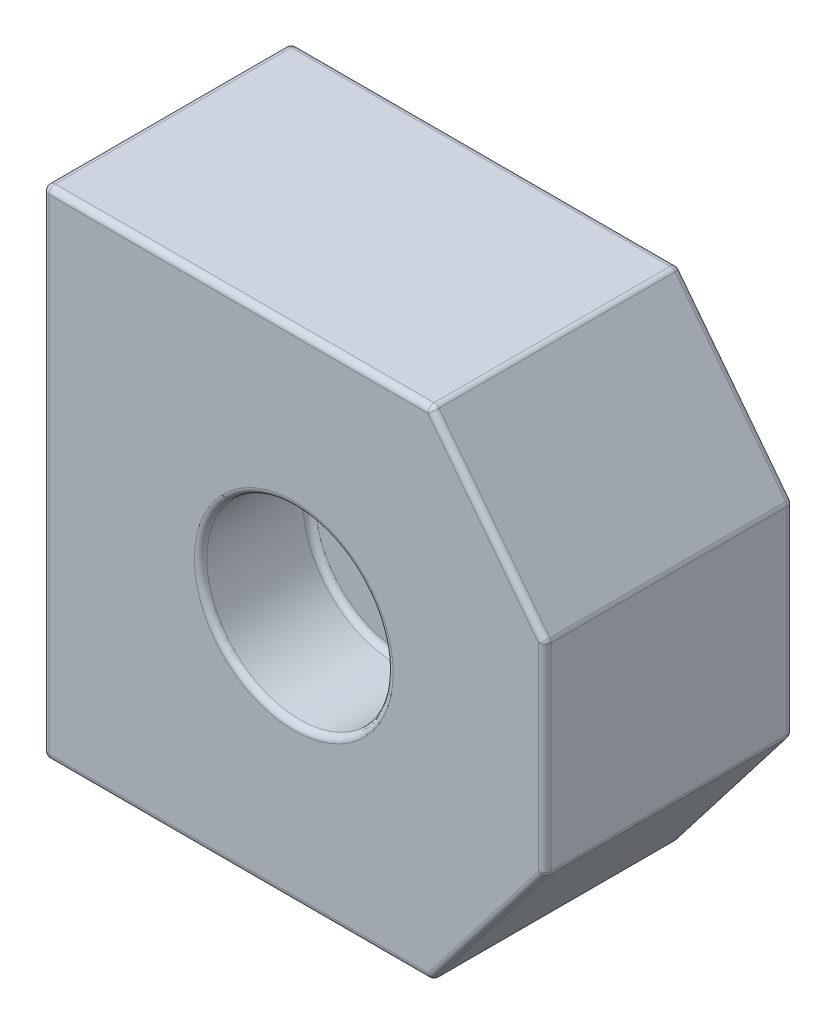
ISO-10303-21;
HEADER;
FILE_DESCRIPTION(('STEP AP214'),'2;1');
FILE_NAME('part.step','',(''),(''),'','','');
FILE_SCHEMA(('AUTOMOTIVE_DESIGN { 1 0 10303 214 1 1 1 1 }'));
ENDSEC;
DATA;
#1=APPLICATION_CONTEXT('core data for automotive mechanical design processes');
#2=APPLICATION_PROTOCOL_DEFINITION('international standard','automotive_design',2000,#1);
#3=PRODUCT_CONTEXT('',#1,'mechanical');
#4=PRODUCT('Part','Part','',(#3));
#5=PRODUCT_RELATED_PRODUCT_CATEGORY('part','',(#4));
#6=PRODUCT_DEFINITION_FORMATION('','',#4);
#7=PRODUCT_DEFINITION_CONTEXT('part definition',#1,'design');
#8=PRODUCT_DEFINITION('design','',#6,#7);
#9=PRODUCT_DEFINITION_SHAPE('','',#8);
#10=(LENGTH_UNIT() NAMED_UNIT(*) SI_UNIT(.MILLI.,.METRE.));
#11=(NAMED_UNIT(*) PLANE_ANGLE_UNIT() SI_UNIT($,.RADIAN.));
#12=(NAMED_UNIT(*) SI_UNIT($,.STERADIAN.) SOLID_ANGLE_UNIT());
#13=UNCERTAINTY_MEASURE_WITH_UNIT(LENGTH_MEASURE(1.E-05),#10,'distance_accuracy_value','');
#14=(GEOMETRIC_REPRESENTATION_CONTEXT(3) GLOBAL_UNCERTAINTY_ASSIGNED_CONTEXT((#13)) GLOBAL_UNIT_ASSIGNED_CONTEXT((#10,
#11,#12)) REPRESENTATION_CONTEXT('',''));
#15=CARTESIAN_POINT('',(0.,0.,0.));
#16=DIRECTION('',(0.,0.,1.));
#17=DIRECTION('',(1.,0.,0.));
#18=AXIS2_PLACEMENT_3D('',#15,#16,#17);
#19=CARTESIAN_POINT('',(25.,0.,16.));
#20=DIRECTION('',(0.,-1.,0.));
#21=DIRECTION('',(1.,0.,0.));
#22=AXIS2_PLACEMENT_3D('',#19,#20,#21);
#23=PLANE('',#22);
#24=DIRECTION('',(-1.,0.,0.));
#25=VECTOR('',#24,1.);
#26=CARTESIAN_POINT('',(25.,0.,15.6));
#27=LINE('',#26,#25);
#28=CARTESIAN_POINT('',(0.4,0.,15.6));
#29=VERTEX_POINT('',#28);
#30=CARTESIAN_POINT('',(24.803429016813,0.,15.6));
#31=VERTEX_POINT('',#30);
#32=EDGE_CURVE('E48',#29,#31,#27,.F.);
#33=ORIENTED_EDGE('',*,*,#32,.T.);
#34=DIRECTION('',(0.,0.,-1.));
#35=VECTOR('',#34,1.);
#36=CARTESIAN_POINT('',(24.803429016813,0.,16.));
#37=LINE('',#36,#35);
#38=CARTESIAN_POINT('',(24.803429016813,0.,0.399999999999999));
#39=VERTEX_POINT('',#38);
#40=EDGE_CURVE('E11',#31,#39,#37,.T.);
#41=ORIENTED_EDGE('',*,*,#40,.T.);
#42=DIRECTION('',(-1.,0.,0.));
#43=VECTOR('',#42,1.);
#44=CARTESIAN_POINT('',(25.,0.,0.399999999999999));
#45=LINE('',#44,#43);
#46=CARTESIAN_POINT('',(0.4,0.,0.399999999999999));
#47=VERTEX_POINT('',#46);
#48=EDGE_CURVE('E270',#39,#47,#45,.T.);
#49=ORIENTED_EDGE('',*,*,#48,.T.);
#50=DIRECTION('',(0.,0.,-1.));
#51=VECTOR('',#50,1.);
#52=CARTESIAN_POINT('',(0.400000000000001,0.,16.));
#53=LINE('',#52,#51);
#54=EDGE_CURVE('E59',#47,#29,#53,.F.);
#55=ORIENTED_EDGE('',*,*,#54,.T.);
#56=EDGE_LOOP('',(#33,#41,#49,#55));
#57=FACE_BOUND('',#56,.T.);
#58=ADVANCED_FACE('F39',(#57),#23,.F.);
#59=CARTESIAN_POINT('',(0.,0.,16.));
#60=DIRECTION('',(1.,0.,0.));
#61=DIRECTION('',(0.,1.,0.));
#62=AXIS2_PLACEMENT_3D('',#59,#60,#61);
#63=PLANE('',#62);
#64=DIRECTION('',(0.,-1.,0.));
#65=VECTOR('',#64,1.);
#66=CARTESIAN_POINT('',(0.,0.,0.399999999999999));
#67=LINE('',#66,#65);
#68=CARTESIAN_POINT('',(0.,-0.4,0.399999999999999));
#69=VERTEX_POINT('',#68);
#70=CARTESIAN_POINT('',(0.,-31.6,0.399999999999999));
#71=VERTEX_POINT('',#70);
#72=EDGE_CURVE('E249',#69,#71,#67,.T.);
#73=ORIENTED_EDGE('',*,*,#72,.T.);
#74=DIRECTION('',(0.,0.,-1.));
#75=VECTOR('',#74,1.);
#76=CARTESIAN_POINT('',(0.,-31.6,16.));
#77=LINE('',#76,#75);
#78=CARTESIAN_POINT('',(0.,-31.6,15.6));
#79=VERTEX_POINT('',#78);
#80=EDGE_CURVE('E251',#71,#79,#77,.F.);
#81=ORIENTED_EDGE('',*,*,#80,.T.);
#82=DIRECTION('',(0.,-1.,0.));
#83=VECTOR('',#82,1.);
#84=CARTESIAN_POINT('',(0.,0.,15.6));
#85=LINE('',#84,#83);
#86=CARTESIAN_POINT('',(0.,-0.4,15.6));
#87=VERTEX_POINT('',#86);
#88=EDGE_CURVE('E247',#79,#87,#85,.F.);
#89=ORIENTED_EDGE('',*,*,#88,.T.);
#90=DIRECTION('',(0.,0.,-1.));
#91=VECTOR('',#90,1.);
#92=CARTESIAN_POINT('',(0.,-0.4,16.));
#93=LINE('',#92,#91);
#94=EDGE_CURVE('E245',#87,#69,#93,.T.);
#95=ORIENTED_EDGE('',*,*,#94,.T.);
#96=EDGE_LOOP('',(#73,#81,#89,#95));
#97=FACE_BOUND('',#96,.T.);
#98=ADVANCED_FACE('F421',(#97),#63,.F.);
#99=CARTESIAN_POINT('',(0.,-32.,16.));
#100=DIRECTION('',(0.,1.,0.));
#101=DIRECTION('',(0.,0.,1.));
#102=AXIS2_PLACEMENT_3D('',#99,#100,#101);
#103=PLANE('',#102);
#104=DIRECTION('',(0.,0.,-1.));
#105=VECTOR('',#104,1.);
#106=CARTESIAN_POINT('',(0.400000000000004,-32.,16.));
#107=LINE('',#106,#105);
#108=CARTESIAN_POINT('',(0.400000000000004,-32.,15.6));
#109=VERTEX_POINT('',#108);
#110=CARTESIAN_POINT('',(0.400000000000004,-32.,0.399999999999999));
#111=VERTEX_POINT('',#110);
#112=EDGE_CURVE('E229',#109,#111,#107,.T.);
#113=ORIENTED_EDGE('',*,*,#112,.T.);
#114=DIRECTION('',(1.,0.,0.));
#115=VECTOR('',#114,1.);
#116=CARTESIAN_POINT('',(0.,-32.,0.399999999999999));
#117=LINE('',#116,#115);
#118=CARTESIAN_POINT('',(24.8034290168129,-32.,0.399999999999999));
#119=VERTEX_POINT('',#118);
#120=EDGE_CURVE('E233',#111,#119,#117,.T.);
#121=ORIENTED_EDGE('',*,*,#120,.T.);
#122=DIRECTION('',(0.,0.,-1.));
#123=VECTOR('',#122,1.);
#124=CARTESIAN_POINT('',(24.8034290168129,-32.,16.));
#125=LINE('',#124,#123);
#126=CARTESIAN_POINT('',(24.8034290168129,-32.,15.6));
#127=VERTEX_POINT('',#126);
#128=EDGE_CURVE('E231',#119,#127,#125,.F.);
#129=ORIENTED_EDGE('',*,*,#128,.T.);
#130=DIRECTION('',(1.,0.,0.));
#131=VECTOR('',#130,1.);
#132=CARTESIAN_POINT('',(0.,-32.,15.6));
#133=LINE('',#132,#131);
#134=EDGE_CURVE('E227',#127,#109,#133,.F.);
#135=ORIENTED_EDGE('',*,*,#134,.T.);
#136=EDGE_LOOP('',(#113,#121,#129,#135));
#137=FACE_BOUND('',#136,.T.);
#138=ADVANCED_FACE('F426',(#137),#103,.F.);
#139=CARTESIAN_POINT('',(25.,-32.,16.));
#140=DIRECTION('',(-0.791666666666667,0.610953262442299,0.));
#141=DIRECTION('',(-0.610953262442299,-0.791666666666667,0.));
#142=AXIS2_PLACEMENT_3D('',#139,#140,#141);
#143=PLANE('',#142);
#144=DIRECTION('',(0.,0.,-1.));
#145=VECTOR('',#144,1.);
#146=CARTESIAN_POINT('',(25.1200956834796,-31.8443813049769,16.));
#147=LINE('',#146,#145);
#148=CARTESIAN_POINT('',(25.1200956834796,-31.8443813049769,15.6));
#149=VERTEX_POINT('',#148);
#150=CARTESIAN_POINT('',(25.1200956834796,-31.8443813049769,0.399999999999999));
#151=VERTEX_POINT('',#150);
#152=EDGE_CURVE('E240',#149,#151,#147,.T.);
#153=ORIENTED_EDGE('',*,*,#152,.T.);
#154=DIRECTION('',(0.610953262442299,0.791666666666667,0.));
#155=VECTOR('',#154,1.);
#156=CARTESIAN_POINT('',(25.,-32.,0.399999999999999));
#157=LINE('',#156,#155);
#158=CARTESIAN_POINT('',(32.2481058159743,-22.6079824370828,0.399999999999999));
#159=VERTEX_POINT('',#158);
#160=EDGE_CURVE('E243',#151,#159,#157,.T.);
#161=ORIENTED_EDGE('',*,*,#160,.T.);
#162=DIRECTION('',(0.,0.,-1.));
#163=VECTOR('',#162,1.);
#164=CARTESIAN_POINT('',(32.2481058159743,-22.6079824370828,16.));
#165=LINE('',#164,#163);
#166=CARTESIAN_POINT('',(32.2481058159743,-22.6079824370828,15.6));
#167=VERTEX_POINT('',#166);
#168=EDGE_CURVE('E238',#159,#167,#165,.F.);
#169=ORIENTED_EDGE('',*,*,#168,.T.);
#170=DIRECTION('',(0.610953262442299,0.791666666666667,0.));
#171=VECTOR('',#170,1.);
#172=CARTESIAN_POINT('',(25.,-32.,15.6));
#173=LINE('',#172,#171);
#174=EDGE_CURVE('E236',#167,#149,#173,.F.);
#175=ORIENTED_EDGE('',*,*,#174,.T.);
#176=EDGE_LOOP('',(#153,#161,#169,#175));
#177=FACE_BOUND('',#176,.T.);
#178=ADVANCED_FACE('F573',(#177),#143,.F.);
#179=CARTESIAN_POINT('',(32.3314391493076,-22.5,16.));
#180=DIRECTION('',(-1.,0.,0.));
#181=DIRECTION('',(0.,0.,1.));
#182=AXIS2_PLACEMENT_3D('',#179,#180,#181);
#183=PLANE('',#182);
#184=DIRECTION('',(0.,1.,0.));
#185=VECTOR('',#184,1.);
#186=CARTESIAN_POINT('',(32.3314391493076,-22.5,0.399999999999999));
#187=LINE('',#186,#185);
#188=CARTESIAN_POINT('',(32.3314391493076,-22.3636011321059,0.399999999999999));
#189=VERTEX_POINT('',#188);
#190=CARTESIAN_POINT('',(32.3314391493076,-9.6363988678941,0.399999999999999));
#191=VERTEX_POINT('',#190);
#192=EDGE_CURVE('E222',#189,#191,#187,.T.);
#193=ORIENTED_EDGE('',*,*,#192,.T.);
#194=DIRECTION('',(0.,0.,-1.));
#195=VECTOR('',#194,1.);
#196=CARTESIAN_POINT('',(32.3314391493076,-9.6363988678941,16.));
#197=LINE('',#196,#195);
#198=CARTESIAN_POINT('',(32.3314391493076,-9.6363988678941,15.6));
#199=VERTEX_POINT('',#198);
#200=EDGE_CURVE('E224',#191,#199,#197,.F.);
#201=ORIENTED_EDGE('',*,*,#200,.T.);
#202=DIRECTION('',(0.,1.,0.));
#203=VECTOR('',#202,1.);
#204=CARTESIAN_POINT('',(32.3314391493076,-22.5,15.6));
#205=LINE('',#204,#203);
#206=CARTESIAN_POINT('',(32.3314391493076,-22.3636011321059,15.6));
#207=VERTEX_POINT('',#206);
#208=EDGE_CURVE('E218',#199,#207,#205,.F.);
#209=ORIENTED_EDGE('',*,*,#208,.T.);
#210=DIRECTION('',(0.,0.,-1.));
#211=VECTOR('',#210,1.);
#212=CARTESIAN_POINT('',(32.3314391493076,-22.3636011321059,16.));
#213=LINE('',#212,#211);
#214=EDGE_CURVE('E220',#207,#189,#213,.T.);
#215=ORIENTED_EDGE('',*,*,#214,.T.);
#216=EDGE_LOOP('',(#193,#201,#209,#215));
#217=FACE_BOUND('',#216,.T.);
#218=ADVANCED_FACE('F570',(#217),#183,.F.);
#219=CARTESIAN_POINT('',(32.3314391493076,-9.5,16.));
#220=DIRECTION('',(-0.791666666666667,-0.610953262442299,0.));
#221=DIRECTION('',(0.610953262442299,-0.791666666666667,0.));
#222=AXIS2_PLACEMENT_3D('',#219,#220,#221);
#223=PLANE('',#222);
#224=DIRECTION('',(0.,0.,-1.));
#225=VECTOR('',#224,1.);
#226=CARTESIAN_POINT('',(32.2481058159743,-9.39201756291718,16.));
#227=LINE('',#226,#225);
#228=CARTESIAN_POINT('',(32.2481058159743,-9.39201756291718,15.6));
#229=VERTEX_POINT('',#228);
#230=CARTESIAN_POINT('',(32.2481058159743,-9.39201756291718,0.399999999999999));
#231=VERTEX_POINT('',#230);
#232=EDGE_CURVE('E198',#229,#231,#227,.T.);
#233=ORIENTED_EDGE('',*,*,#232,.T.);
#234=DIRECTION('',(-0.610953262442299,0.791666666666667,0.));
#235=VECTOR('',#234,1.);
#236=CARTESIAN_POINT('',(32.3314391493076,-9.5,0.399999999999999));
#237=LINE('',#236,#235);
#238=CARTESIAN_POINT('',(25.1200956834796,-0.155618695023082,0.399999999999999));
#239=VERTEX_POINT('',#238);
#240=EDGE_CURVE('E169',#231,#239,#237,.T.);
#241=ORIENTED_EDGE('',*,*,#240,.T.);
#242=DIRECTION('',(0.,0.,-1.));
#243=VECTOR('',#242,1.);
#244=CARTESIAN_POINT('',(25.1200956834796,-0.155618695023084,16.));
#245=LINE('',#244,#243);
#246=CARTESIAN_POINT('',(25.1200956834796,-0.155618695023082,15.6));
#247=VERTEX_POINT('',#246);
#248=EDGE_CURVE('E187',#239,#247,#245,.F.);
#249=ORIENTED_EDGE('',*,*,#248,.T.);
#250=DIRECTION('',(-0.610953262442299,0.791666666666667,0.));
#251=VECTOR('',#250,1.);
#252=CARTESIAN_POINT('',(32.3314391493076,-9.5,15.6));
#253=LINE('',#252,#251);
#254=EDGE_CURVE('E193',#247,#229,#253,.F.);
#255=ORIENTED_EDGE('',*,*,#254,.T.);
#256=EDGE_LOOP('',(#233,#241,#249,#255));
#257=FACE_BOUND('',#256,.T.);
#258=ADVANCED_FACE('F196',(#257),#223,.F.);
#259=CARTESIAN_POINT('',(0.,0.,16.));
#260=DIRECTION('',(0.,0.,1.));
#261=DIRECTION('',(1.,0.,0.));
#262=AXIS2_PLACEMENT_3D('',#259,#260,#261);
#263=PLANE('',#262);
#264=CARTESIAN_POINT('',(16.1657195746538,-16.,16.));
#265=DIRECTION('',(0.,0.,1.));
#266=DIRECTION('',(1.,0.,0.));
#267=AXIS2_PLACEMENT_3D('',#264,#265,#266);
#268=CIRCLE('',#267,6.4);
#269=CARTESIAN_POINT('',(22.5657195746538,-16.,16.));
#270=VERTEX_POINT('',#269);
#271=EDGE_CURVE('E267',#270,#270,#268,.F.);
#272=ORIENTED_EDGE('',*,*,#271,.T.);
#273=EDGE_LOOP('',(#272));
#274=FACE_BOUND('',#273,.T.);
#275=DIRECTION('',(0.,1.,0.));
#276=VECTOR('',#275,1.);
#277=CARTESIAN_POINT('',(31.9314391493076,-9.5,16.));
#278=LINE('',#277,#276);
#279=CARTESIAN_POINT('',(31.9314391493076,-22.3636011321059,16.));
#280=VERTEX_POINT('',#279);
#281=CARTESIAN_POINT('',(31.9314391493076,-9.6363988678941,16.));
#282=VERTEX_POINT('',#281);
#283=EDGE_CURVE('E262',#280,#282,#278,.T.);
#284=ORIENTED_EDGE('',*,*,#283,.T.);
#285=DIRECTION('',(-0.610953262442299,0.791666666666667,0.));
#286=VECTOR('',#285,1.);
#287=CARTESIAN_POINT('',(24.6833333333333,-0.244381304976924,16.));
#288=LINE('',#287,#286);
#289=CARTESIAN_POINT('',(24.803429016813,-0.400000000000002,16.));
#290=VERTEX_POINT('',#289);
#291=EDGE_CURVE('E264',#282,#290,#288,.T.);
#292=ORIENTED_EDGE('',*,*,#291,.T.);
#293=DIRECTION('',(-1.,0.,0.));
#294=VECTOR('',#293,1.);
#295=CARTESIAN_POINT('',(0.,-0.4,16.));
#296=LINE('',#295,#294);
#297=CARTESIAN_POINT('',(0.4,-0.4,16.));
#298=VERTEX_POINT('',#297);
#299=EDGE_CURVE('E254',#290,#298,#296,.T.);
#300=ORIENTED_EDGE('',*,*,#299,.T.);
#301=DIRECTION('',(0.,-1.,0.));
#302=VECTOR('',#301,1.);
#303=CARTESIAN_POINT('',(0.400000000000004,-32.,16.));
#304=LINE('',#303,#302);
#305=CARTESIAN_POINT('',(0.400000000000004,-31.6,16.));
#306=VERTEX_POINT('',#305);
#307=EDGE_CURVE('E256',#298,#306,#304,.T.);
#308=ORIENTED_EDGE('',*,*,#307,.T.);
#309=DIRECTION('',(1.,0.,0.));
#310=VECTOR('',#309,1.);
#311=CARTESIAN_POINT('',(25.,-31.6,16.));
#312=LINE('',#311,#310);
#313=CARTESIAN_POINT('',(24.803429016813,-31.6,16.));
#314=VERTEX_POINT('',#313);
#315=EDGE_CURVE('E258',#306,#314,#312,.T.);
#316=ORIENTED_EDGE('',*,*,#315,.T.);
#317=DIRECTION('',(0.610953262442299,0.791666666666667,0.));
#318=VECTOR('',#317,1.);
#319=CARTESIAN_POINT('',(32.0147724826409,-22.2556186950231,16.));
#320=LINE('',#319,#318);
#321=EDGE_CURVE('E260',#314,#280,#320,.T.);
#322=ORIENTED_EDGE('',*,*,#321,.T.);
#323=EDGE_LOOP('',(#284,#292,#300,#308,#316,#322));
#324=FACE_BOUND('',#323,.T.);
#325=ADVANCED_FACE('F561',(#274,#324),#263,.T.);
#326=CARTESIAN_POINT('',(0.,0.,0.));
#327=DIRECTION('',(0.,0.,1.));
#328=DIRECTION('',(1.,0.,0.));
#329=AXIS2_PLACEMENT_3D('',#326,#327,#328);
#330=PLANE('',#329);
#331=DIRECTION('',(-0.610953262442299,0.791666666666667,0.));
#332=VECTOR('',#331,1.);
#333=CARTESIAN_POINT('',(15.3517361111111,11.8474020141936,0.));
#334=LINE('',#333,#332);
#335=CARTESIAN_POINT('',(24.803429016813,-0.400000000000002,0.));
#336=VERTEX_POINT('',#335);
#337=CARTESIAN_POINT('',(31.9314391493076,-9.6363988678941,0.));
#338=VERTEX_POINT('',#337);
#339=EDGE_CURVE('E171',#336,#338,#334,.F.);
#340=ORIENTED_EDGE('',*,*,#339,.T.);
#341=DIRECTION('',(0.,1.,0.));
#342=VECTOR('',#341,1.);
#343=CARTESIAN_POINT('',(31.9314391493076,0.,0.));
#344=LINE('',#343,#342);
#345=CARTESIAN_POINT('',(31.9314391493076,-22.3636011321059,0.));
#346=VERTEX_POINT('',#345);
#347=EDGE_CURVE('E216',#338,#346,#344,.F.);
#348=ORIENTED_EDGE('',*,*,#347,.T.);
#349=DIRECTION('',(0.610953262442299,0.791666666666667,0.));
#350=VECTOR('',#349,1.);
#351=CARTESIAN_POINT('',(30.8292187596494,-23.791846458638,0.));
#352=LINE('',#351,#350);
#353=CARTESIAN_POINT('',(24.8034290168129,-31.6,0.));
#354=VERTEX_POINT('',#353);
#355=EDGE_CURVE('E214',#346,#354,#352,.F.);
#356=ORIENTED_EDGE('',*,*,#355,.T.);
#357=DIRECTION('',(1.,0.,0.));
#358=VECTOR('',#357,1.);
#359=CARTESIAN_POINT('',(0.,-31.6,0.));
#360=LINE('',#359,#358);
#361=CARTESIAN_POINT('',(0.400000000000004,-31.6,0.));
#362=VERTEX_POINT('',#361);
#363=EDGE_CURVE('E211',#354,#362,#360,.F.);
#364=ORIENTED_EDGE('',*,*,#363,.T.);
#365=DIRECTION('',(0.,-1.,0.));
#366=VECTOR('',#365,1.);
#367=CARTESIAN_POINT('',(0.4,0.,0.));
#368=LINE('',#367,#366);
#369=CARTESIAN_POINT('',(0.4,-0.4,0.));
#370=VERTEX_POINT('',#369);
#371=EDGE_CURVE('E209',#362,#370,#368,.F.);
#372=ORIENTED_EDGE('',*,*,#371,.T.);
#373=DIRECTION('',(-1.,0.,0.));
#374=VECTOR('',#373,1.);
#375=CARTESIAN_POINT('',(0.,-0.4,0.));
#376=LINE('',#375,#374);
#377=EDGE_CURVE('E203',#370,#336,#376,.F.);
#378=ORIENTED_EDGE('',*,*,#377,.T.);
#379=EDGE_LOOP('',(#340,#348,#356,#364,#372,#378));
#380=FACE_BOUND('',#379,.T.);
#381=CARTESIAN_POINT('',(16.1657195746538,-16.,0.));
#382=DIRECTION('',(0.,0.,1.));
#383=DIRECTION('',(1.,0.,0.));
#384=AXIS2_PLACEMENT_3D('',#381,#382,#383);
#385=CIRCLE('',#384,3.6);
#386=CARTESIAN_POINT('',(19.7657195746538,-16.,0.));
#387=VERTEX_POINT('',#386);
#388=EDGE_CURVE('E200',#387,#387,#385,.T.);
#389=ORIENTED_EDGE('',*,*,#388,.T.);
#390=EDGE_LOOP('',(#389));
#391=FACE_BOUND('',#390,.T.);
#392=ADVANCED_FACE('F412',(#380,#391),#330,.F.);
#393=CARTESIAN_POINT('',(16.1657195746538,-16.,9.));
#394=DIRECTION('',(0.,0.,1.));
#395=DIRECTION('',(1.,0.,0.));
#396=AXIS2_PLACEMENT_3D('',#393,#394,#395);
#397=CYLINDRICAL_SURFACE('',#396,6.);
#398=CARTESIAN_POINT('',(16.1657195746538,-16.,9.4));
#399=DIRECTION('',(0.,0.,1.));
#400=DIRECTION('',(1.,0.,0.));
#401=AXIS2_PLACEMENT_3D('',#398,#399,#400);
#402=CIRCLE('',#401,6.);
#403=CARTESIAN_POINT('',(22.1657195746538,-16.,9.4));
#404=VERTEX_POINT('',#403);
#405=EDGE_CURVE('E194',#404,#404,#402,.F.);
#406=ORIENTED_EDGE('',*,*,#405,.T.);
#407=EDGE_LOOP('',(#406));
#408=FACE_BOUND('',#407,.T.);
#409=CARTESIAN_POINT('',(16.1657195746538,-16.,15.6));
#410=DIRECTION('',(0.,0.,1.));
#411=DIRECTION('',(1.,0.,0.));
#412=AXIS2_PLACEMENT_3D('',#409,#410,#411);
#413=CIRCLE('',#412,6.);
#414=CARTESIAN_POINT('',(22.1657195746538,-16.,15.6));
#415=VERTEX_POINT('',#414);
#416=EDGE_CURVE('E384',#415,#415,#413,.T.);
#417=ORIENTED_EDGE('',*,*,#416,.T.);
#418=EDGE_LOOP('',(#417));
#419=FACE_BOUND('',#418,.T.);
#420=ADVANCED_FACE('F550',(#408,#419),#397,.F.);
#421=CARTESIAN_POINT('',(16.1657195746538,-16.,9.));
#422=DIRECTION('',(0.,0.,1.));
#423=DIRECTION('',(1.,0.,0.));
#424=AXIS2_PLACEMENT_3D('',#421,#422,#423);
#425=PLANE('',#424);
#426=CARTESIAN_POINT('',(16.1657195746538,-16.,9.));
#427=DIRECTION('',(0.,0.,1.));
#428=DIRECTION('',(1.,0.,0.));
#429=AXIS2_PLACEMENT_3D('',#426,#427,#428);
#430=CIRCLE('',#429,3.6);
#431=CARTESIAN_POINT('',(19.7657195746538,-16.,9.));
#432=VERTEX_POINT('',#431);
#433=EDGE_CURVE('E381',#432,#432,#430,.F.);
#434=ORIENTED_EDGE('',*,*,#433,.T.);
#435=EDGE_LOOP('',(#434));
#436=FACE_BOUND('',#435,.T.);
#437=CARTESIAN_POINT('',(16.1657195746538,-16.,9.));
#438=DIRECTION('',(0.,0.,1.));
#439=DIRECTION('',(1.,0.,0.));
#440=AXIS2_PLACEMENT_3D('',#437,#438,#439);
#441=CIRCLE('',#440,5.6);
#442=CARTESIAN_POINT('',(21.7657195746538,-16.,9.));
#443=VERTEX_POINT('',#442);
#444=EDGE_CURVE('E376',#443,#443,#441,.T.);
#445=ORIENTED_EDGE('',*,*,#444,.T.);
#446=EDGE_LOOP('',(#445));
#447=FACE_BOUND('',#446,.T.);
#448=ADVANCED_FACE('F552',(#436,#447),#425,.T.);
#449=CARTESIAN_POINT('',(16.1657195746538,-16.,-1.99999999999999));
#450=DIRECTION('',(0.,0.,1.));
#451=DIRECTION('',(1.,0.,0.));
#452=AXIS2_PLACEMENT_3D('',#449,#450,#451);
#453=CYLINDRICAL_SURFACE('',#452,3.2);
#454=CARTESIAN_POINT('',(16.1657195746538,-16.,8.6));
#455=DIRECTION('',(0.,0.,1.));
#456=DIRECTION('',(1.,0.,0.));
#457=AXIS2_PLACEMENT_3D('',#454,#455,#456);
#458=CIRCLE('',#457,3.2);
#459=CARTESIAN_POINT('',(19.3657195746538,-16.,8.6));
#460=VERTEX_POINT('',#459);
#461=EDGE_CURVE('E371',#460,#460,#458,.T.);
#462=ORIENTED_EDGE('',*,*,#461,.T.);
#463=EDGE_LOOP('',(#462));
#464=FACE_BOUND('',#463,.T.);
#465=CARTESIAN_POINT('',(16.1657195746538,-16.,0.4));
#466=DIRECTION('',(0.,0.,1.));
#467=DIRECTION('',(1.,0.,0.));
#468=AXIS2_PLACEMENT_3D('',#465,#466,#467);
#469=CIRCLE('',#468,3.2);
#470=CARTESIAN_POINT('',(19.3657195746538,-16.,0.4));
#471=VERTEX_POINT('',#470);
#472=EDGE_CURVE('E365',#471,#471,#469,.F.);
#473=ORIENTED_EDGE('',*,*,#472,.T.);
#474=EDGE_LOOP('',(#473));
#475=FACE_BOUND('',#474,.T.);
#476=ADVANCED_FACE('F435',(#464,#475),#453,.F.);
#477=CARTESIAN_POINT('',(16.1657195746538,-16.,8.6));
#478=DIRECTION('',(0.,0.,1.));
#479=DIRECTION('',(1.,0.,0.));
#480=AXIS2_PLACEMENT_3D('',#477,#478,#479);
#481=TOROIDAL_SURFACE('',#480,3.6,0.4);
#482=ORIENTED_EDGE('',*,*,#433,.F.);
#483=EDGE_LOOP('',(#482));
#484=FACE_BOUND('',#483,.T.);
#485=ORIENTED_EDGE('',*,*,#461,.F.);
#486=EDGE_LOOP('',(#485));
#487=FACE_BOUND('',#486,.T.);
#488=ADVANCED_FACE('F431',(#484,#487),#481,.T.);
#489=CARTESIAN_POINT('',(16.1657195746538,-16.,9.4));
#490=DIRECTION('',(0.,0.,1.));
#491=DIRECTION('',(1.,0.,0.));
#492=AXIS2_PLACEMENT_3D('',#489,#490,#491);
#493=TOROIDAL_SURFACE('',#492,5.6,0.4);
#494=ORIENTED_EDGE('',*,*,#405,.F.);
#495=EDGE_LOOP('',(#494));
#496=FACE_BOUND('',#495,.T.);
#497=ORIENTED_EDGE('',*,*,#444,.F.);
#498=EDGE_LOOP('',(#497));
#499=FACE_BOUND('',#498,.T.);
#500=ADVANCED_FACE('F434',(#496,#499),#493,.F.);
#501=CARTESIAN_POINT('',(0.,-31.6,15.6));
#502=DIRECTION('',(-1.,0.,0.));
#503=DIRECTION('',(0.,0.,1.));
#504=AXIS2_PLACEMENT_3D('',#501,#502,#503);
#505=CYLINDRICAL_SURFACE('',#504,0.4);
#506=CARTESIAN_POINT('',(24.803429016813,-31.6,15.6));
#507=DIRECTION('',(1.,0.,0.));
#508=DIRECTION('',(0.,1.,0.));
#509=AXIS2_PLACEMENT_3D('',#506,#507,#508);
#510=CIRCLE('',#509,0.4);
#511=EDGE_CURVE('E43',#314,#127,#510,.T.);
#512=ORIENTED_EDGE('',*,*,#511,.F.);
#513=ORIENTED_EDGE('',*,*,#315,.F.);
#514=CARTESIAN_POINT('',(0.400000000000004,-31.6,15.6));
#515=DIRECTION('',(-1.,0.,0.));
#516=DIRECTION('',(0.,0.,1.));
#517=AXIS2_PLACEMENT_3D('',#514,#515,#516);
#518=CIRCLE('',#517,0.4);
#519=EDGE_CURVE('E358',#109,#306,#518,.T.);
#520=ORIENTED_EDGE('',*,*,#519,.F.);
#521=ORIENTED_EDGE('',*,*,#134,.F.);
#522=EDGE_LOOP('',(#512,#513,#520,#521));
#523=FACE_BOUND('',#522,.T.);
#524=ADVANCED_FACE('F439',(#523),#505,.T.);
#525=CARTESIAN_POINT('',(24.8034290168129,-31.6,15.6));
#526=DIRECTION('',(0.,0.,1.));
#527=DIRECTION('',(1.,0.,0.));
#528=AXIS2_PLACEMENT_3D('',#525,#526,#527);
#529=SPHERICAL_SURFACE('',#528,0.4);
#530=CARTESIAN_POINT('',(24.8034290168129,-31.6,15.6));
#531=DIRECTION('',(-0.610953262442301,-0.791666666666665,0.));
#532=DIRECTION('',(0.791666666666665,-0.610953262442301,0.));
#533=AXIS2_PLACEMENT_3D('',#530,#531,#532);
#534=CIRCLE('',#533,0.4);
#535=EDGE_CURVE('E353',#314,#149,#534,.F.);
#536=ORIENTED_EDGE('',*,*,#535,.F.);
#537=ORIENTED_EDGE('',*,*,#511,.T.);
#538=CARTESIAN_POINT('',(24.8034290168129,-31.6,15.6));
#539=DIRECTION('',(0.,0.,1.));
#540=DIRECTION('',(1.,0.,0.));
#541=AXIS2_PLACEMENT_3D('',#538,#539,#540);
#542=CIRCLE('',#541,0.4);
#543=EDGE_CURVE('E356',#149,#127,#542,.F.);
#544=ORIENTED_EDGE('',*,*,#543,.F.);
#545=EDGE_LOOP('',(#536,#537,#544));
#546=FACE_BOUND('',#545,.T.);
#547=ADVANCED_FACE('F535',(#546),#529,.T.);
#548=CARTESIAN_POINT('',(0.400000000000004,-31.6,15.6));
#549=DIRECTION('',(0.,0.,1.));
#550=DIRECTION('',(1.,0.,0.));
#551=AXIS2_PLACEMENT_3D('',#548,#549,#550);
#552=SPHERICAL_SURFACE('',#551,0.4);
#553=CARTESIAN_POINT('',(0.400000000000004,-31.6,15.6));
#554=DIRECTION('',(0.,0.,1.));
#555=DIRECTION('',(1.,0.,0.));
#556=AXIS2_PLACEMENT_3D('',#553,#554,#555);
#557=CIRCLE('',#556,0.4);
#558=EDGE_CURVE('E347',#109,#79,#557,.F.);
#559=ORIENTED_EDGE('',*,*,#558,.F.);
#560=ORIENTED_EDGE('',*,*,#519,.T.);
#561=CARTESIAN_POINT('',(0.400000000000004,-31.6,15.6));
#562=DIRECTION('',(0.,-1.,0.));
#563=DIRECTION('',(0.,0.,-1.));
#564=AXIS2_PLACEMENT_3D('',#561,#562,#563);
#565=CIRCLE('',#564,0.4);
#566=EDGE_CURVE('E350',#79,#306,#565,.F.);
#567=ORIENTED_EDGE('',*,*,#566,.F.);
#568=EDGE_LOOP('',(#559,#560,#567));
#569=FACE_BOUND('',#568,.T.);
#570=ADVANCED_FACE('F531',(#569),#552,.T.);
#571=CARTESIAN_POINT('',(24.8034290168129,-31.6,16.));
#572=DIRECTION('',(0.,0.,-1.));
#573=DIRECTION('',(-1.,0.,0.));
#574=AXIS2_PLACEMENT_3D('',#571,#572,#573);
#575=CYLINDRICAL_SURFACE('',#574,0.4);
#576=ORIENTED_EDGE('',*,*,#543,.T.);
#577=ORIENTED_EDGE('',*,*,#128,.F.);
#578=CARTESIAN_POINT('',(24.8034290168129,-31.6,0.399999999999999));
#579=DIRECTION('',(0.,0.,-1.));
#580=DIRECTION('',(-1.,0.,0.));
#581=AXIS2_PLACEMENT_3D('',#578,#579,#580);
#582=CIRCLE('',#581,0.4);
#583=EDGE_CURVE('E342',#151,#119,#582,.T.);
#584=ORIENTED_EDGE('',*,*,#583,.F.);
#585=ORIENTED_EDGE('',*,*,#152,.F.);
#586=EDGE_LOOP('',(#576,#577,#584,#585));
#587=FACE_BOUND('',#586,.T.);
#588=ADVANCED_FACE('F527',(#587),#575,.T.);
#589=CARTESIAN_POINT('',(30.8292187596494,-23.791846458638,15.6));
#590=DIRECTION('',(-0.610953262442299,-0.791666666666667,0.));
#591=DIRECTION('',(0.791666666666667,-0.610953262442299,0.));
#592=AXIS2_PLACEMENT_3D('',#589,#590,#591);
#593=CYLINDRICAL_SURFACE('',#592,0.4);
#594=ORIENTED_EDGE('',*,*,#535,.T.);
#595=ORIENTED_EDGE('',*,*,#174,.F.);
#596=CARTESIAN_POINT('',(31.9314391493076,-22.3636011321059,15.6));
#597=DIRECTION('',(0.610953262442295,0.79166666666667,0.));
#598=DIRECTION('',(-0.79166666666667,0.610953262442295,0.));
#599=AXIS2_PLACEMENT_3D('',#596,#597,#598);
#600=CIRCLE('',#599,0.4);
#601=EDGE_CURVE('E339',#280,#167,#600,.T.);
#602=ORIENTED_EDGE('',*,*,#601,.F.);
#603=ORIENTED_EDGE('',*,*,#321,.F.);
#604=EDGE_LOOP('',(#594,#595,#602,#603));
#605=FACE_BOUND('',#604,.T.);
#606=ADVANCED_FACE('F523',(#605),#593,.T.);
#607=CARTESIAN_POINT('',(0.4,0.,15.6));
#608=DIRECTION('',(0.,1.,0.));
#609=DIRECTION('',(-1.,0.,0.));
#610=AXIS2_PLACEMENT_3D('',#607,#608,#609);
#611=CYLINDRICAL_SURFACE('',#610,0.4);
#612=ORIENTED_EDGE('',*,*,#566,.T.);
#613=ORIENTED_EDGE('',*,*,#307,.F.);
#614=CARTESIAN_POINT('',(0.4,-0.4,15.6));
#615=DIRECTION('',(0.,1.,0.));
#616=DIRECTION('',(-1.,0.,0.));
#617=AXIS2_PLACEMENT_3D('',#614,#615,#616);
#618=CIRCLE('',#617,0.4);
#619=EDGE_CURVE('E336',#87,#298,#618,.T.);
#620=ORIENTED_EDGE('',*,*,#619,.F.);
#621=ORIENTED_EDGE('',*,*,#88,.F.);
#622=EDGE_LOOP('',(#612,#613,#620,#621));
#623=FACE_BOUND('',#622,.T.);
#624=ADVANCED_FACE('F519',(#623),#611,.T.);
#625=CARTESIAN_POINT('',(0.400000000000004,-31.6,16.));
#626=DIRECTION('',(0.,0.,-1.));
#627=DIRECTION('',(-1.,0.,0.));
#628=AXIS2_PLACEMENT_3D('',#625,#626,#627);
#629=CYLINDRICAL_SURFACE('',#628,0.4);
#630=ORIENTED_EDGE('',*,*,#558,.T.);
#631=ORIENTED_EDGE('',*,*,#80,.F.);
#632=CARTESIAN_POINT('',(0.400000000000004,-31.6,0.399999999999999));
#633=DIRECTION('',(0.,0.,-1.));
#634=DIRECTION('',(-1.,0.,0.));
#635=AXIS2_PLACEMENT_3D('',#632,#633,#634);
#636=CIRCLE('',#635,0.4);
#637=EDGE_CURVE('E333',#111,#71,#636,.T.);
#638=ORIENTED_EDGE('',*,*,#637,.F.);
#639=ORIENTED_EDGE('',*,*,#112,.F.);
#640=EDGE_LOOP('',(#630,#631,#638,#639));
#641=FACE_BOUND('',#640,.T.);
#642=ADVANCED_FACE('F515',(#641),#629,.T.);
#643=CARTESIAN_POINT('',(0.,-31.6,0.399999999999999));
#644=DIRECTION('',(1.,0.,0.));
#645=DIRECTION('',(0.,0.,-1.));
#646=AXIS2_PLACEMENT_3D('',#643,#644,#645);
#647=CYLINDRICAL_SURFACE('',#646,0.4);
#648=CARTESIAN_POINT('',(24.8034290168129,-31.6,0.399999999999999));
#649=DIRECTION('',(1.,0.,0.));
#650=DIRECTION('',(0.,0.,-1.));
#651=AXIS2_PLACEMENT_3D('',#648,#649,#650);
#652=CIRCLE('',#651,0.4);
#653=EDGE_CURVE('E344',#119,#354,#652,.T.);
#654=ORIENTED_EDGE('',*,*,#653,.F.);
#655=ORIENTED_EDGE('',*,*,#120,.F.);
#656=CARTESIAN_POINT('',(0.400000000000004,-31.6,0.4));
#657=DIRECTION('',(-1.,0.,0.));
#658=DIRECTION('',(0.,0.,1.));
#659=AXIS2_PLACEMENT_3D('',#656,#657,#658);
#660=CIRCLE('',#659,0.4);
#661=EDGE_CURVE('E330',#362,#111,#660,.T.);
#662=ORIENTED_EDGE('',*,*,#661,.F.);
#663=ORIENTED_EDGE('',*,*,#363,.F.);
#664=EDGE_LOOP('',(#654,#655,#662,#663));
#665=FACE_BOUND('',#664,.T.);
#666=ADVANCED_FACE('F511',(#665),#647,.T.);
#667=CARTESIAN_POINT('',(24.8034290168129,-31.6,0.4));
#668=DIRECTION('',(0.,0.,-1.));
#669=DIRECTION('',(-1.,0.,0.));
#670=AXIS2_PLACEMENT_3D('',#667,#668,#669);
#671=SPHERICAL_SURFACE('',#670,0.4);
#672=ORIENTED_EDGE('',*,*,#583,.T.);
#673=ORIENTED_EDGE('',*,*,#653,.T.);
#674=CARTESIAN_POINT('',(24.8034290168129,-31.6,0.4));
#675=DIRECTION('',(-0.610953262442301,-0.791666666666665,0.));
#676=DIRECTION('',(0.791666666666665,-0.610953262442301,0.));
#677=AXIS2_PLACEMENT_3D('',#674,#675,#676);
#678=CIRCLE('',#677,0.4);
#679=EDGE_CURVE('E327',#151,#354,#678,.F.);
#680=ORIENTED_EDGE('',*,*,#679,.F.);
#681=EDGE_LOOP('',(#672,#673,#680));
#682=FACE_BOUND('',#681,.T.);
#683=ADVANCED_FACE('F507',(#682),#671,.T.);
#684=CARTESIAN_POINT('',(31.9314391493076,-22.3636011321059,15.6));
#685=DIRECTION('',(0.,0.,1.));
#686=DIRECTION('',(0.,-1.,0.));
#687=AXIS2_PLACEMENT_3D('',#684,#685,#686);
#688=SPHERICAL_SURFACE('',#687,0.4);
#689=CARTESIAN_POINT('',(31.9314391493076,-22.3636011321059,15.6));
#690=DIRECTION('',(0.,-1.,0.));
#691=DIRECTION('',(0.,0.,-1.));
#692=AXIS2_PLACEMENT_3D('',#689,#690,#691);
#693=CIRCLE('',#692,0.4);
#694=EDGE_CURVE('E321',#280,#207,#693,.F.);
#695=ORIENTED_EDGE('',*,*,#694,.F.);
#696=ORIENTED_EDGE('',*,*,#601,.T.);
#697=CARTESIAN_POINT('',(31.9314391493076,-22.3636011321059,15.6));
#698=DIRECTION('',(0.,0.,1.));
#699=DIRECTION('',(1.,0.,0.));
#700=AXIS2_PLACEMENT_3D('',#697,#698,#699);
#701=CIRCLE('',#700,0.4);
#702=EDGE_CURVE('E324',#207,#167,#701,.F.);
#703=ORIENTED_EDGE('',*,*,#702,.F.);
#704=EDGE_LOOP('',(#695,#696,#703));
#705=FACE_BOUND('',#704,.T.);
#706=ADVANCED_FACE('F503',(#705),#688,.T.);
#707=CARTESIAN_POINT('',(0.4,-0.4,15.6));
#708=DIRECTION('',(0.,0.,1.));
#709=DIRECTION('',(1.,0.,0.));
#710=AXIS2_PLACEMENT_3D('',#707,#708,#709);
#711=SPHERICAL_SURFACE('',#710,0.4);
#712=CARTESIAN_POINT('',(0.4,-0.4,15.6));
#713=DIRECTION('',(0.,0.,1.));
#714=DIRECTION('',(1.,0.,0.));
#715=AXIS2_PLACEMENT_3D('',#712,#713,#714);
#716=CIRCLE('',#715,0.4);
#717=EDGE_CURVE('E316',#87,#29,#716,.F.);
#718=ORIENTED_EDGE('',*,*,#717,.F.);
#719=ORIENTED_EDGE('',*,*,#619,.T.);
#720=CARTESIAN_POINT('',(0.4,-0.4,15.6));
#721=DIRECTION('',(-1.,0.,0.));
#722=DIRECTION('',(0.,-1.,0.));
#723=AXIS2_PLACEMENT_3D('',#720,#721,#722);
#724=CIRCLE('',#723,0.4);
#725=EDGE_CURVE('E318',#29,#298,#724,.F.);
#726=ORIENTED_EDGE('',*,*,#725,.F.);
#727=EDGE_LOOP('',(#718,#719,#726));
#728=FACE_BOUND('',#727,.T.);
#729=ADVANCED_FACE('F499',(#728),#711,.T.);
#730=CARTESIAN_POINT('',(0.400000000000004,-31.6,0.4));
#731=DIRECTION('',(0.,-1.,0.));
#732=DIRECTION('',(0.,0.,-1.));
#733=AXIS2_PLACEMENT_3D('',#730,#731,#732);
#734=SPHERICAL_SURFACE('',#733,0.4);
#735=ORIENTED_EDGE('',*,*,#661,.T.);
#736=ORIENTED_EDGE('',*,*,#637,.T.);
#737=CARTESIAN_POINT('',(0.400000000000004,-31.6,0.399999999999999));
#738=DIRECTION('',(0.,-1.,0.));
#739=DIRECTION('',(0.,0.,-1.));
#740=AXIS2_PLACEMENT_3D('',#737,#738,#739);
#741=CIRCLE('',#740,0.4);
#742=EDGE_CURVE('E313',#362,#71,#741,.F.);
#743=ORIENTED_EDGE('',*,*,#742,.F.);
#744=EDGE_LOOP('',(#735,#736,#743));
#745=FACE_BOUND('',#744,.T.);
#746=ADVANCED_FACE('F495',(#745),#734,.T.);
#747=CARTESIAN_POINT('',(24.6833333333333,-31.7556186950231,0.399999999999999));
#748=DIRECTION('',(0.610953262442299,0.791666666666667,0.));
#749=DIRECTION('',(-0.791666666666667,0.610953262442299,0.));
#750=AXIS2_PLACEMENT_3D('',#747,#748,#749);
#751=CYLINDRICAL_SURFACE('',#750,0.4);
#752=ORIENTED_EDGE('',*,*,#679,.T.);
#753=ORIENTED_EDGE('',*,*,#355,.F.);
#754=CARTESIAN_POINT('',(31.9314391493076,-22.3636011321059,0.399999999999999));
#755=DIRECTION('',(0.610953262442301,0.791666666666665,0.));
#756=DIRECTION('',(-0.791666666666665,0.610953262442301,0.));
#757=AXIS2_PLACEMENT_3D('',#754,#755,#756);
#758=CIRCLE('',#757,0.4);
#759=EDGE_CURVE('E310',#159,#346,#758,.T.);
#760=ORIENTED_EDGE('',*,*,#759,.F.);
#761=ORIENTED_EDGE('',*,*,#160,.F.);
#762=EDGE_LOOP('',(#752,#753,#760,#761));
#763=FACE_BOUND('',#762,.T.);
#764=ADVANCED_FACE('F491',(#763),#751,.T.);
#765=CARTESIAN_POINT('',(31.9314391493076,-22.3636011321059,16.));
#766=DIRECTION('',(0.,0.,-1.));
#767=DIRECTION('',(-1.,0.,0.));
#768=AXIS2_PLACEMENT_3D('',#765,#766,#767);
#769=CYLINDRICAL_SURFACE('',#768,0.4);
#770=ORIENTED_EDGE('',*,*,#702,.T.);
#771=ORIENTED_EDGE('',*,*,#168,.F.);
#772=CARTESIAN_POINT('',(31.9314391493076,-22.3636011321059,0.399999999999999));
#773=DIRECTION('',(0.,0.,-1.));
#774=DIRECTION('',(-1.,0.,0.));
#775=AXIS2_PLACEMENT_3D('',#772,#773,#774);
#776=CIRCLE('',#775,0.4);
#777=EDGE_CURVE('E307',#189,#159,#776,.T.);
#778=ORIENTED_EDGE('',*,*,#777,.F.);
#779=ORIENTED_EDGE('',*,*,#214,.F.);
#780=EDGE_LOOP('',(#770,#771,#778,#779));
#781=FACE_BOUND('',#780,.T.);
#782=ADVANCED_FACE('F487',(#781),#769,.T.);
#783=CARTESIAN_POINT('',(31.9314391493076,0.,15.6));
#784=DIRECTION('',(0.,-1.,0.));
#785=DIRECTION('',(0.,0.,-1.));
#786=AXIS2_PLACEMENT_3D('',#783,#784,#785);
#787=CYLINDRICAL_SURFACE('',#786,0.4);
#788=ORIENTED_EDGE('',*,*,#694,.T.);
#789=ORIENTED_EDGE('',*,*,#208,.F.);
#790=CARTESIAN_POINT('',(31.9314391493076,-9.6363988678941,15.6));
#791=DIRECTION('',(0.,1.,0.));
#792=DIRECTION('',(-1.,0.,0.));
#793=AXIS2_PLACEMENT_3D('',#790,#791,#792);
#794=CIRCLE('',#793,0.4);
#795=EDGE_CURVE('E304',#282,#199,#794,.T.);
#796=ORIENTED_EDGE('',*,*,#795,.F.);
#797=ORIENTED_EDGE('',*,*,#283,.F.);
#798=EDGE_LOOP('',(#788,#789,#796,#797));
#799=FACE_BOUND('',#798,.T.);
#800=ADVANCED_FACE('F484',(#799),#787,.T.);
#801=CARTESIAN_POINT('',(15.3517361111111,11.8474020141936,15.6));
#802=DIRECTION('',(0.610953262442299,-0.791666666666667,0.));
#803=DIRECTION('',(0.791666666666667,0.610953262442299,0.));
#804=AXIS2_PLACEMENT_3D('',#801,#802,#803);
#805=CYLINDRICAL_SURFACE('',#804,0.4);
#806=CARTESIAN_POINT('',(24.803429016813,-0.400000000000003,15.6));
#807=DIRECTION('',(-0.6109532624423,0.791666666666666,0.));
#808=DIRECTION('',(-0.791666666666666,-0.6109532624423,0.));
#809=AXIS2_PLACEMENT_3D('',#806,#807,#808);
#810=CIRCLE('',#809,0.4);
#811=EDGE_CURVE('E298',#290,#247,#810,.T.);
#812=ORIENTED_EDGE('',*,*,#811,.F.);
#813=ORIENTED_EDGE('',*,*,#291,.F.);
#814=CARTESIAN_POINT('',(31.9314391493076,-9.6363988678941,15.6));
#815=DIRECTION('',(0.610953262442298,-0.791666666666668,0.));
#816=DIRECTION('',(0.791666666666668,0.610953262442298,0.));
#817=AXIS2_PLACEMENT_3D('',#814,#815,#816);
#818=CIRCLE('',#817,0.4);
#819=EDGE_CURVE('E301',#229,#282,#818,.T.);
#820=ORIENTED_EDGE('',*,*,#819,.F.);
#821=ORIENTED_EDGE('',*,*,#254,.F.);
#822=EDGE_LOOP('',(#812,#813,#820,#821));
#823=FACE_BOUND('',#822,.T.);
#824=ADVANCED_FACE('F393',(#823),#805,.T.);
#825=CARTESIAN_POINT('',(0.,-0.4,15.6));
#826=DIRECTION('',(1.,0.,0.));
#827=DIRECTION('',(0.,1.,0.));
#828=AXIS2_PLACEMENT_3D('',#825,#826,#827);
#829=CYLINDRICAL_SURFACE('',#828,0.4);
#830=ORIENTED_EDGE('',*,*,#725,.T.);
#831=ORIENTED_EDGE('',*,*,#299,.F.);
#832=CARTESIAN_POINT('',(24.803429016813,-0.400000000000002,15.6));
#833=DIRECTION('',(1.,0.,0.));
#834=DIRECTION('',(0.,0.,-1.));
#835=AXIS2_PLACEMENT_3D('',#832,#833,#834);
#836=CIRCLE('',#835,0.4);
#837=EDGE_CURVE('E296',#31,#290,#836,.T.);
#838=ORIENTED_EDGE('',*,*,#837,.F.);
#839=ORIENTED_EDGE('',*,*,#32,.F.);
#840=EDGE_LOOP('',(#830,#831,#838,#839));
#841=FACE_BOUND('',#840,.T.);
#842=ADVANCED_FACE('F477',(#841),#829,.T.);
#843=CARTESIAN_POINT('',(0.4,-0.4,16.));
#844=DIRECTION('',(0.,0.,-1.));
#845=DIRECTION('',(-1.,0.,0.));
#846=AXIS2_PLACEMENT_3D('',#843,#844,#845);
#847=CYLINDRICAL_SURFACE('',#846,0.4);
#848=ORIENTED_EDGE('',*,*,#717,.T.);
#849=ORIENTED_EDGE('',*,*,#54,.F.);
#850=CARTESIAN_POINT('',(0.4,-0.4,0.399999999999999));
#851=DIRECTION('',(0.,0.,-1.));
#852=DIRECTION('',(-1.,0.,0.));
#853=AXIS2_PLACEMENT_3D('',#850,#851,#852);
#854=CIRCLE('',#853,0.4);
#855=EDGE_CURVE('E293',#69,#47,#854,.T.);
#856=ORIENTED_EDGE('',*,*,#855,.F.);
#857=ORIENTED_EDGE('',*,*,#94,.F.);
#858=EDGE_LOOP('',(#848,#849,#856,#857));
#859=FACE_BOUND('',#858,.T.);
#860=ADVANCED_FACE('F473',(#859),#847,.T.);
#861=CARTESIAN_POINT('',(0.4,0.,0.399999999999999));
#862=DIRECTION('',(0.,-1.,0.));
#863=DIRECTION('',(1.,0.,0.));
#864=AXIS2_PLACEMENT_3D('',#861,#862,#863);
#865=CYLINDRICAL_SURFACE('',#864,0.4);
#866=ORIENTED_EDGE('',*,*,#742,.T.);
#867=ORIENTED_EDGE('',*,*,#72,.F.);
#868=CARTESIAN_POINT('',(0.4,-0.4,0.4));
#869=DIRECTION('',(0.,1.,0.));
#870=DIRECTION('',(-1.,0.,0.));
#871=AXIS2_PLACEMENT_3D('',#868,#869,#870);
#872=CIRCLE('',#871,0.4);
#873=EDGE_CURVE('E290',#370,#69,#872,.T.);
#874=ORIENTED_EDGE('',*,*,#873,.F.);
#875=ORIENTED_EDGE('',*,*,#371,.F.);
#876=EDGE_LOOP('',(#866,#867,#874,#875));
#877=FACE_BOUND('',#876,.T.);
#878=ADVANCED_FACE('F469',(#877),#865,.T.);
#879=CARTESIAN_POINT('',(31.9314391493076,-22.3636011321059,0.4));
#880=DIRECTION('',(0.,0.,-1.));
#881=DIRECTION('',(-1.,0.,0.));
#882=AXIS2_PLACEMENT_3D('',#879,#880,#881);
#883=SPHERICAL_SURFACE('',#882,0.4);
#884=ORIENTED_EDGE('',*,*,#777,.T.);
#885=ORIENTED_EDGE('',*,*,#759,.T.);
#886=CARTESIAN_POINT('',(31.9314391493076,-22.3636011321059,0.4));
#887=DIRECTION('',(0.,-1.,0.));
#888=DIRECTION('',(0.,0.,-1.));
#889=AXIS2_PLACEMENT_3D('',#886,#887,#888);
#890=CIRCLE('',#889,0.4);
#891=EDGE_CURVE('E287',#189,#346,#890,.F.);
#892=ORIENTED_EDGE('',*,*,#891,.F.);
#893=EDGE_LOOP('',(#884,#885,#892));
#894=FACE_BOUND('',#893,.T.);
#895=ADVANCED_FACE('F466',(#894),#883,.T.);
#896=CARTESIAN_POINT('',(31.9314391493076,-9.6363988678941,15.6));
#897=DIRECTION('',(0.,0.,1.));
#898=DIRECTION('',(0.,-1.,0.));
#899=AXIS2_PLACEMENT_3D('',#896,#897,#898);
#900=SPHERICAL_SURFACE('',#899,0.4);
#901=ORIENTED_EDGE('',*,*,#819,.T.);
#902=ORIENTED_EDGE('',*,*,#795,.T.);
#903=CARTESIAN_POINT('',(31.9314391493076,-9.6363988678941,15.6));
#904=DIRECTION('',(0.,0.,1.));
#905=DIRECTION('',(1.,0.,0.));
#906=AXIS2_PLACEMENT_3D('',#903,#904,#905);
#907=CIRCLE('',#906,0.4);
#908=EDGE_CURVE('E285',#229,#199,#907,.F.);
#909=ORIENTED_EDGE('',*,*,#908,.F.);
#910=EDGE_LOOP('',(#901,#902,#909));
#911=FACE_BOUND('',#910,.T.);
#912=ADVANCED_FACE('F396',(#911),#900,.T.);
#913=CARTESIAN_POINT('',(24.803429016813,-0.400000000000002,15.6));
#914=DIRECTION('',(0.,0.,1.));
#915=DIRECTION('',(1.,0.,0.));
#916=AXIS2_PLACEMENT_3D('',#913,#914,#915);
#917=SPHERICAL_SURFACE('',#916,0.4);
#918=ORIENTED_EDGE('',*,*,#837,.T.);
#919=ORIENTED_EDGE('',*,*,#811,.T.);
#920=CARTESIAN_POINT('',(24.803429016813,-0.400000000000002,15.6));
#921=DIRECTION('',(0.,0.,1.));
#922=DIRECTION('',(1.,0.,0.));
#923=AXIS2_PLACEMENT_3D('',#920,#921,#922);
#924=CIRCLE('',#923,0.4);
#925=EDGE_CURVE('E190',#31,#247,#924,.F.);
#926=ORIENTED_EDGE('',*,*,#925,.F.);
#927=EDGE_LOOP('',(#918,#919,#926));
#928=FACE_BOUND('',#927,.T.);
#929=ADVANCED_FACE('F459',(#928),#917,.T.);
#930=CARTESIAN_POINT('',(0.4,-0.4,0.4));
#931=DIRECTION('',(-1.,0.,0.));
#932=DIRECTION('',(0.,0.,1.));
#933=AXIS2_PLACEMENT_3D('',#930,#931,#932);
#934=SPHERICAL_SURFACE('',#933,0.4);
#935=ORIENTED_EDGE('',*,*,#873,.T.);
#936=ORIENTED_EDGE('',*,*,#855,.T.);
#937=CARTESIAN_POINT('',(0.4,-0.4,0.399999999999999));
#938=DIRECTION('',(-1.,0.,0.));
#939=DIRECTION('',(0.,-1.,0.));
#940=AXIS2_PLACEMENT_3D('',#937,#938,#939);
#941=CIRCLE('',#940,0.4);
#942=EDGE_CURVE('E281',#370,#47,#941,.F.);
#943=ORIENTED_EDGE('',*,*,#942,.F.);
#944=EDGE_LOOP('',(#935,#936,#943));
#945=FACE_BOUND('',#944,.T.);
#946=ADVANCED_FACE('F456',(#945),#934,.T.);
#947=CARTESIAN_POINT('',(31.9314391493076,-22.5,0.399999999999999));
#948=DIRECTION('',(0.,1.,0.));
#949=DIRECTION('',(0.,0.,1.));
#950=AXIS2_PLACEMENT_3D('',#947,#948,#949);
#951=CYLINDRICAL_SURFACE('',#950,0.4);
#952=ORIENTED_EDGE('',*,*,#891,.T.);
#953=ORIENTED_EDGE('',*,*,#347,.F.);
#954=CARTESIAN_POINT('',(31.9314391493076,-9.6363988678941,0.399999999999999));
#955=DIRECTION('',(0.,1.,0.));
#956=DIRECTION('',(0.,0.,1.));
#957=AXIS2_PLACEMENT_3D('',#954,#955,#956);
#958=CIRCLE('',#957,0.4);
#959=EDGE_CURVE('E278',#191,#338,#958,.T.);
#960=ORIENTED_EDGE('',*,*,#959,.F.);
#961=ORIENTED_EDGE('',*,*,#192,.F.);
#962=EDGE_LOOP('',(#952,#953,#960,#961));
#963=FACE_BOUND('',#962,.T.);
#964=ADVANCED_FACE('F408',(#963),#951,.T.);
#965=CARTESIAN_POINT('',(31.9314391493076,-9.6363988678941,16.));
#966=DIRECTION('',(0.,0.,-1.));
#967=DIRECTION('',(-1.,0.,0.));
#968=AXIS2_PLACEMENT_3D('',#965,#966,#967);
#969=CYLINDRICAL_SURFACE('',#968,0.4);
#970=ORIENTED_EDGE('',*,*,#908,.T.);
#971=ORIENTED_EDGE('',*,*,#200,.F.);
#972=CARTESIAN_POINT('',(31.9314391493076,-9.6363988678941,0.399999999999999));
#973=DIRECTION('',(0.,0.,-1.));
#974=DIRECTION('',(-1.,0.,0.));
#975=AXIS2_PLACEMENT_3D('',#972,#973,#974);
#976=CIRCLE('',#975,0.4);
#977=EDGE_CURVE('E184',#231,#191,#976,.T.);
#978=ORIENTED_EDGE('',*,*,#977,.F.);
#979=ORIENTED_EDGE('',*,*,#232,.F.);
#980=EDGE_LOOP('',(#970,#971,#978,#979));
#981=FACE_BOUND('',#980,.T.);
#982=ADVANCED_FACE('F400',(#981),#969,.T.);
#983=CARTESIAN_POINT('',(24.803429016813,-0.400000000000002,16.));
#984=DIRECTION('',(0.,0.,-1.));
#985=DIRECTION('',(-1.,0.,0.));
#986=AXIS2_PLACEMENT_3D('',#983,#984,#985);
#987=CYLINDRICAL_SURFACE('',#986,0.4);
#988=ORIENTED_EDGE('',*,*,#925,.T.);
#989=ORIENTED_EDGE('',*,*,#248,.F.);
#990=CARTESIAN_POINT('',(24.803429016813,-0.400000000000002,0.399999999999999));
#991=DIRECTION('',(0.,0.,-1.));
#992=DIRECTION('',(-1.,0.,0.));
#993=AXIS2_PLACEMENT_3D('',#990,#991,#992);
#994=CIRCLE('',#993,0.4);
#995=EDGE_CURVE('E176',#39,#239,#994,.T.);
#996=ORIENTED_EDGE('',*,*,#995,.F.);
#997=ORIENTED_EDGE('',*,*,#40,.F.);
#998=EDGE_LOOP('',(#988,#989,#996,#997));
#999=FACE_BOUND('',#998,.T.);
#1000=ADVANCED_FACE('F188',(#999),#987,.T.);
#1001=CARTESIAN_POINT('',(25.,-0.400000000000002,0.399999999999999));
#1002=DIRECTION('',(-1.,0.,0.));
#1003=DIRECTION('',(0.,-1.,0.));
#1004=AXIS2_PLACEMENT_3D('',#1001,#1002,#1003);
#1005=CYLINDRICAL_SURFACE('',#1004,0.4);
#1006=ORIENTED_EDGE('',*,*,#942,.T.);
#1007=ORIENTED_EDGE('',*,*,#48,.F.);
#1008=CARTESIAN_POINT('',(24.803429016813,-0.400000000000002,0.4));
#1009=DIRECTION('',(1.,0.,0.));
#1010=DIRECTION('',(0.,0.,-1.));
#1011=AXIS2_PLACEMENT_3D('',#1008,#1009,#1010);
#1012=CIRCLE('',#1011,0.4);
#1013=EDGE_CURVE('E180',#336,#39,#1012,.T.);
#1014=ORIENTED_EDGE('',*,*,#1013,.F.);
#1015=ORIENTED_EDGE('',*,*,#377,.F.);
#1016=EDGE_LOOP('',(#1006,#1007,#1014,#1015));
#1017=FACE_BOUND('',#1016,.T.);
#1018=ADVANCED_FACE('F418',(#1017),#1005,.T.);
#1019=CARTESIAN_POINT('',(31.9314391493076,-9.6363988678941,0.4));
#1020=DIRECTION('',(0.,0.,-1.));
#1021=DIRECTION('',(-1.,0.,0.));
#1022=AXIS2_PLACEMENT_3D('',#1019,#1020,#1021);
#1023=SPHERICAL_SURFACE('',#1022,0.4);
#1024=ORIENTED_EDGE('',*,*,#977,.T.);
#1025=ORIENTED_EDGE('',*,*,#959,.T.);
#1026=CARTESIAN_POINT('',(31.9314391493076,-9.6363988678941,0.4));
#1027=DIRECTION('',(0.610953262442301,-0.791666666666665,0.));
#1028=DIRECTION('',(0.791666666666665,0.610953262442301,0.));
#1029=AXIS2_PLACEMENT_3D('',#1026,#1027,#1028);
#1030=CIRCLE('',#1029,0.4);
#1031=EDGE_CURVE('E173',#231,#338,#1030,.F.);
#1032=ORIENTED_EDGE('',*,*,#1031,.F.);
#1033=EDGE_LOOP('',(#1024,#1025,#1032));
#1034=FACE_BOUND('',#1033,.T.);
#1035=ADVANCED_FACE('F404',(#1034),#1023,.T.);
#1036=CARTESIAN_POINT('',(24.803429016813,-0.400000000000002,0.4));
#1037=DIRECTION('',(0.,0.,-1.));
#1038=DIRECTION('',(0.,1.,0.));
#1039=AXIS2_PLACEMENT_3D('',#1036,#1037,#1038);
#1040=SPHERICAL_SURFACE('',#1039,0.4);
#1041=ORIENTED_EDGE('',*,*,#1013,.T.);
#1042=ORIENTED_EDGE('',*,*,#995,.T.);
#1043=CARTESIAN_POINT('',(24.803429016813,-0.400000000000002,0.399999999999999));
#1044=DIRECTION('',(-0.6109532624423,0.791666666666667,0.));
#1045=DIRECTION('',(-0.791666666666667,-0.6109532624423,0.));
#1046=AXIS2_PLACEMENT_3D('',#1043,#1044,#1045);
#1047=CIRCLE('',#1046,0.4);
#1048=EDGE_CURVE('E165',#336,#239,#1047,.F.);
#1049=ORIENTED_EDGE('',*,*,#1048,.F.);
#1050=EDGE_LOOP('',(#1041,#1042,#1049));
#1051=FACE_BOUND('',#1050,.T.);
#1052=ADVANCED_FACE('F178',(#1051),#1040,.T.);
#1053=CARTESIAN_POINT('',(32.0147724826409,-9.74438130497692,0.399999999999999));
#1054=DIRECTION('',(-0.610953262442299,0.791666666666667,0.));
#1055=DIRECTION('',(-0.791666666666667,-0.610953262442299,0.));
#1056=AXIS2_PLACEMENT_3D('',#1053,#1054,#1055);
#1057=CYLINDRICAL_SURFACE('',#1056,0.4);
#1058=ORIENTED_EDGE('',*,*,#1031,.T.);
#1059=ORIENTED_EDGE('',*,*,#339,.F.);
#1060=ORIENTED_EDGE('',*,*,#1048,.T.);
#1061=ORIENTED_EDGE('',*,*,#240,.F.);
#1062=EDGE_LOOP('',(#1058,#1059,#1060,#1061));
#1063=FACE_BOUND('',#1062,.T.);
#1064=ADVANCED_FACE('F167',(#1063),#1057,.T.);
#1065=CARTESIAN_POINT('',(16.1657195746538,-16.,15.6));
#1066=DIRECTION('',(0.,0.,1.));
#1067=DIRECTION('',(1.,0.,0.));
#1068=AXIS2_PLACEMENT_3D('',#1065,#1066,#1067);
#1069=TOROIDAL_SURFACE('',#1068,6.4,0.4);
#1070=ORIENTED_EDGE('',*,*,#271,.F.);
#1071=EDGE_LOOP('',(#1070));
#1072=FACE_BOUND('',#1071,.T.);
#1073=ORIENTED_EDGE('',*,*,#416,.F.);
#1074=EDGE_LOOP('',(#1073));
#1075=FACE_BOUND('',#1074,.T.);
#1076=ADVANCED_FACE('F443',(#1072,#1075),#1069,.T.);
#1077=CARTESIAN_POINT('',(16.1657195746538,-16.,0.4));
#1078=DIRECTION('',(0.,0.,1.));
#1079=DIRECTION('',(1.,0.,0.));
#1080=AXIS2_PLACEMENT_3D('',#1077,#1078,#1079);
#1081=TOROIDAL_SURFACE('',#1080,3.6,0.4);
#1082=ORIENTED_EDGE('',*,*,#472,.F.);
#1083=EDGE_LOOP('',(#1082));
#1084=FACE_BOUND('',#1083,.T.);
#1085=ORIENTED_EDGE('',*,*,#388,.F.);
#1086=EDGE_LOOP('',(#1085));
#1087=FACE_BOUND('',#1086,.T.);
#1088=ADVANCED_FACE('F41',(#1084,#1087),#1081,.T.);
#1089=CLOSED_SHELL('',(#58,#98,#138,#178,#218,#258,#325,#392,#420,#448,#476,#488,#500,#524,#547,
#570,#588,#606,#624,#642,#666,#683,#706,#729,#746,#764,#782,#800,#824,#842,#860,#878,#895,#912,
#929,#946,#964,#982,#1000,#1018,#1035,#1052,#1064,#1076,#1088));
#1090=MANIFOLD_SOLID_BREP('B2',#1089);
#1091=ADVANCED_BREP_SHAPE_REPRESENTATION('',(#18,#1090),#14);
#1092=SHAPE_DEFINITION_REPRESENTATION(#9,#1091);
ENDSEC;
END-ISO-10303-21;
